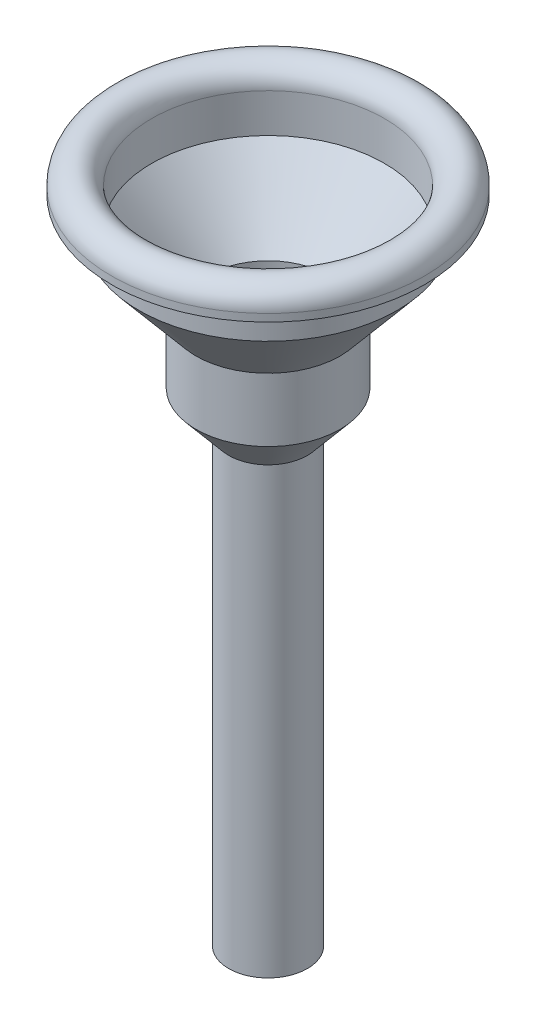
ISO-10303-21;
HEADER;
FILE_DESCRIPTION(('STEP AP214'),'2;1');
FILE_NAME('part.step','',(''),(''),'','','');
FILE_SCHEMA(('AUTOMOTIVE_DESIGN { 1 0 10303 214 1 1 1 1 }'));
ENDSEC;
DATA;
#1=APPLICATION_CONTEXT('core data for automotive mechanical design processes');
#2=APPLICATION_PROTOCOL_DEFINITION('international standard','automotive_design',2000,#1);
#3=PRODUCT_CONTEXT('',#1,'mechanical');
#4=PRODUCT('Part','Part','',(#3));
#5=PRODUCT_RELATED_PRODUCT_CATEGORY('part','',(#4));
#6=PRODUCT_DEFINITION_FORMATION('','',#4);
#7=PRODUCT_DEFINITION_CONTEXT('part definition',#1,'design');
#8=PRODUCT_DEFINITION('design','',#6,#7);
#9=PRODUCT_DEFINITION_SHAPE('','',#8);
#10=(LENGTH_UNIT() NAMED_UNIT(*) SI_UNIT(.MILLI.,.METRE.));
#11=(NAMED_UNIT(*) PLANE_ANGLE_UNIT() SI_UNIT($,.RADIAN.));
#12=(NAMED_UNIT(*) SI_UNIT($,.STERADIAN.) SOLID_ANGLE_UNIT());
#13=UNCERTAINTY_MEASURE_WITH_UNIT(LENGTH_MEASURE(1.E-05),#10,'distance_accuracy_value','');
#14=(GEOMETRIC_REPRESENTATION_CONTEXT(3) GLOBAL_UNCERTAINTY_ASSIGNED_CONTEXT((#13)) GLOBAL_UNIT_ASSIGNED_CONTEXT((#10,
#11,#12)) REPRESENTATION_CONTEXT('',''));
#15=CARTESIAN_POINT('',(0.,0.,0.));
#16=DIRECTION('',(0.,0.,1.));
#17=DIRECTION('',(1.,0.,0.));
#18=AXIS2_PLACEMENT_3D('',#15,#16,#17);
#19=CARTESIAN_POINT('',(0.,5.18497830182876,0.));
#20=DIRECTION('',(0.,-1.,0.));
#21=DIRECTION('',(1.,0.,0.));
#22=AXIS2_PLACEMENT_3D('',#19,#20,#21);
#23=TOROIDAL_SURFACE('',#22,1.07473695625731,0.157670585602117);
#24=CARTESIAN_POINT('',(0.,5.18497830182876,0.));
#25=DIRECTION('',(0.,-1.,0.));
#26=DIRECTION('',(1.,0.,0.));
#27=AXIS2_PLACEMENT_3D('',#24,#25,#26);
#28=CIRCLE('',#27,1.23240754185942);
#29=CARTESIAN_POINT('',(1.23240754185943,5.18497830182876,0.));
#30=VERTEX_POINT('',#29);
#31=EDGE_CURVE('E111',#30,#30,#28,.T.);
#32=ORIENTED_EDGE('',*,*,#31,.F.);
#33=EDGE_LOOP('',(#32));
#34=FACE_BOUND('',#33,.T.);
#35=CARTESIAN_POINT('',(0.,5.18497830182876,0.));
#36=DIRECTION('',(0.,-1.,0.));
#37=DIRECTION('',(1.,0.,0.));
#38=AXIS2_PLACEMENT_3D('',#35,#36,#37);
#39=CIRCLE('',#38,0.91706637065519);
#40=CARTESIAN_POINT('',(0.917066370655195,5.18497830182876,0.));
#41=VERTEX_POINT('',#40);
#42=EDGE_CURVE('E10',#41,#41,#39,.T.);
#43=ORIENTED_EDGE('',*,*,#42,.T.);
#44=EDGE_LOOP('',(#43));
#45=FACE_BOUND('',#44,.T.);
#46=ADVANCED_FACE('F42',(#34,#45),#23,.T.);
#47=CARTESIAN_POINT('',(0.,-31.3486062493764,0.));
#48=DIRECTION('',(0.,-1.,0.));
#49=DIRECTION('',(1.,0.,0.));
#50=AXIS2_PLACEMENT_3D('',#47,#48,#49);
#51=CYLINDRICAL_SURFACE('',#50,0.91706637065519);
#52=ORIENTED_EDGE('',*,*,#42,.F.);
#53=EDGE_LOOP('',(#52));
#54=FACE_BOUND('',#53,.T.);
#55=CARTESIAN_POINT('',(0.,4.87904591085749,0.));
#56=DIRECTION('',(0.,-1.,0.));
#57=DIRECTION('',(1.,0.,0.));
#58=AXIS2_PLACEMENT_3D('',#55,#56,#57);
#59=CIRCLE('',#58,0.917066370655189);
#60=CARTESIAN_POINT('',(0.917066370655194,4.87904591085749,0.));
#61=VERTEX_POINT('',#60);
#62=EDGE_CURVE('E49',#61,#61,#59,.T.);
#63=ORIENTED_EDGE('',*,*,#62,.T.);
#64=EDGE_LOOP('',(#63));
#65=FACE_BOUND('',#64,.T.);
#66=ADVANCED_FACE('F120',(#54,#65),#51,.F.);
#67=CARTESIAN_POINT('',(0.,4.34281480067421,0.));
#68=DIRECTION('',(0.,1.,0.));
#69=DIRECTION('',(-1.,0.,0.));
#70=AXIS2_PLACEMENT_3D('',#67,#68,#69);
#71=CONICAL_SURFACE('',#70,0.467115043874611,0.698131700797739);
#72=ORIENTED_EDGE('',*,*,#62,.F.);
#73=EDGE_LOOP('',(#72));
#74=FACE_BOUND('',#73,.T.);
#75=CARTESIAN_POINT('',(0.,4.34281480067421,0.));
#76=DIRECTION('',(0.,-1.,0.));
#77=DIRECTION('',(1.,0.,0.));
#78=AXIS2_PLACEMENT_3D('',#75,#76,#77);
#79=CIRCLE('',#78,0.467115043874611);
#80=CARTESIAN_POINT('',(0.467115043874617,4.34281480067421,0.));
#81=VERTEX_POINT('',#80);
#82=EDGE_CURVE('E56',#81,#81,#79,.T.);
#83=ORIENTED_EDGE('',*,*,#82,.T.);
#84=EDGE_LOOP('',(#83));
#85=FACE_BOUND('',#84,.T.);
#86=ADVANCED_FACE('F124',(#74,#85),#71,.F.);
#87=CARTESIAN_POINT('',(0.,-31.3486062493764,0.));
#88=DIRECTION('',(0.,-1.,0.));
#89=DIRECTION('',(1.,0.,0.));
#90=AXIS2_PLACEMENT_3D('',#87,#88,#89);
#91=CYLINDRICAL_SURFACE('',#90,0.467115043874611);
#92=ORIENTED_EDGE('',*,*,#82,.F.);
#93=EDGE_LOOP('',(#92));
#94=FACE_BOUND('',#93,.T.);
#95=CARTESIAN_POINT('',(0.,3.84281480067421,0.));
#96=DIRECTION('',(0.,-1.,0.));
#97=DIRECTION('',(1.,0.,0.));
#98=AXIS2_PLACEMENT_3D('',#95,#96,#97);
#99=CIRCLE('',#98,0.467115043874611);
#100=CARTESIAN_POINT('',(0.467115043874617,3.84281480067421,0.));
#101=VERTEX_POINT('',#100);
#102=EDGE_CURVE('E63',#101,#101,#99,.T.);
#103=ORIENTED_EDGE('',*,*,#102,.T.);
#104=EDGE_LOOP('',(#103));
#105=FACE_BOUND('',#104,.T.);
#106=ADVANCED_FACE('F129',(#94,#105),#91,.F.);
#107=CARTESIAN_POINT('',(0.,3.60790223898227,0.));
#108=DIRECTION('',(0.,1.,0.));
#109=DIRECTION('',(-1.,0.,0.));
#110=AXIS2_PLACEMENT_3D('',#107,#108,#109);
#111=CONICAL_SURFACE('',#110,0.269999999999994,0.698131700797732);
#112=ORIENTED_EDGE('',*,*,#102,.F.);
#113=EDGE_LOOP('',(#112));
#114=FACE_BOUND('',#113,.T.);
#115=CARTESIAN_POINT('',(0.,3.60790223898227,0.));
#116=DIRECTION('',(0.,-1.,0.));
#117=DIRECTION('',(1.,0.,0.));
#118=AXIS2_PLACEMENT_3D('',#115,#116,#117);
#119=CIRCLE('',#118,0.269999999999994);
#120=CARTESIAN_POINT('',(0.27,3.60790223898227,0.));
#121=VERTEX_POINT('',#120);
#122=EDGE_CURVE('E69',#121,#121,#119,.T.);
#123=ORIENTED_EDGE('',*,*,#122,.T.);
#124=EDGE_LOOP('',(#123));
#125=FACE_BOUND('',#124,.T.);
#126=ADVANCED_FACE('F135',(#114,#125),#111,.F.);
#127=CARTESIAN_POINT('',(0.,-31.3486062493764,0.));
#128=DIRECTION('',(0.,-1.,0.));
#129=DIRECTION('',(1.,0.,0.));
#130=AXIS2_PLACEMENT_3D('',#127,#128,#129);
#131=CYLINDRICAL_SURFACE('',#130,0.269999999999997);
#132=ORIENTED_EDGE('',*,*,#122,.F.);
#133=EDGE_LOOP('',(#132));
#134=FACE_BOUND('',#133,.T.);
#135=CARTESIAN_POINT('',(0.,0.,0.));
#136=DIRECTION('',(0.,-1.,0.));
#137=DIRECTION('',(1.,0.,0.));
#138=AXIS2_PLACEMENT_3D('',#135,#136,#137);
#139=CIRCLE('',#138,0.27);
#140=CARTESIAN_POINT('',(0.270000000000006,0.,0.));
#141=VERTEX_POINT('',#140);
#142=EDGE_CURVE('E73',#141,#141,#139,.T.);
#143=ORIENTED_EDGE('',*,*,#142,.T.);
#144=EDGE_LOOP('',(#143));
#145=FACE_BOUND('',#144,.T.);
#146=ADVANCED_FACE('F139',(#134,#145),#131,.F.);
#147=CARTESIAN_POINT('',(0.,0.,0.));
#148=DIRECTION('',(0.,-1.,0.));
#149=DIRECTION('',(1.,0.,0.));
#150=AXIS2_PLACEMENT_3D('',#147,#148,#149);
#151=PLANE('',#150);
#152=CARTESIAN_POINT('',(0.,0.,0.));
#153=DIRECTION('',(0.,-1.,0.));
#154=DIRECTION('',(1.,0.,0.));
#155=AXIS2_PLACEMENT_3D('',#152,#153,#154);
#156=CIRCLE('',#155,0.309999999999994);
#157=CARTESIAN_POINT('',(0.31,0.,0.));
#158=VERTEX_POINT('',#157);
#159=EDGE_CURVE('E76',#158,#158,#156,.T.);
#160=ORIENTED_EDGE('',*,*,#159,.T.);
#161=EDGE_LOOP('',(#160));
#162=FACE_BOUND('',#161,.T.);
#163=ORIENTED_EDGE('',*,*,#142,.F.);
#164=EDGE_LOOP('',(#163));
#165=FACE_BOUND('',#164,.T.);
#166=ADVANCED_FACE('F143',(#162,#165),#151,.T.);
#167=CARTESIAN_POINT('',(0.,-31.3486062493764,0.));
#168=DIRECTION('',(0.,-1.,0.));
#169=DIRECTION('',(1.,0.,0.));
#170=AXIS2_PLACEMENT_3D('',#167,#168,#169);
#171=CYLINDRICAL_SURFACE('',#170,0.309999999999994);
#172=CARTESIAN_POINT('',(0.,3.5,0.));
#173=DIRECTION('',(0.,-1.,0.));
#174=DIRECTION('',(1.,0.,0.));
#175=AXIS2_PLACEMENT_3D('',#172,#173,#174);
#176=CIRCLE('',#175,0.309999999999995);
#177=CARTESIAN_POINT('',(0.31,3.5,0.));
#178=VERTEX_POINT('',#177);
#179=EDGE_CURVE('E80',#178,#178,#176,.T.);
#180=ORIENTED_EDGE('',*,*,#179,.T.);
#181=EDGE_LOOP('',(#180));
#182=FACE_BOUND('',#181,.T.);
#183=ORIENTED_EDGE('',*,*,#159,.F.);
#184=EDGE_LOOP('',(#183));
#185=FACE_BOUND('',#184,.T.);
#186=ADVANCED_FACE('F147',(#182,#185),#171,.T.);
#187=CARTESIAN_POINT('',(0.,3.5,0.));
#188=DIRECTION('',(0.,1.,0.));
#189=DIRECTION('',(-1.,0.,0.));
#190=AXIS2_PLACEMENT_3D('',#187,#188,#189);
#191=CONICAL_SURFACE('',#190,0.309999999999995,0.698131700797738);
#192=CARTESIAN_POINT('',(0.,3.80641777724759,0.));
#193=DIRECTION('',(0.,-1.,0.));
#194=DIRECTION('',(1.,0.,0.));
#195=AXIS2_PLACEMENT_3D('',#192,#193,#194);
#196=CIRCLE('',#195,0.567115043874612);
#197=CARTESIAN_POINT('',(0.567115043874617,3.80641777724759,0.));
#198=VERTEX_POINT('',#197);
#199=EDGE_CURVE('E84',#198,#198,#196,.T.);
#200=ORIENTED_EDGE('',*,*,#199,.T.);
#201=EDGE_LOOP('',(#200));
#202=FACE_BOUND('',#201,.T.);
#203=ORIENTED_EDGE('',*,*,#179,.F.);
#204=EDGE_LOOP('',(#203));
#205=FACE_BOUND('',#204,.T.);
#206=ADVANCED_FACE('F151',(#202,#205),#191,.T.);
#207=CARTESIAN_POINT('',(0.,-31.3486062493764,0.));
#208=DIRECTION('',(0.,-1.,0.));
#209=DIRECTION('',(1.,0.,0.));
#210=AXIS2_PLACEMENT_3D('',#207,#208,#209);
#211=CYLINDRICAL_SURFACE('',#210,0.567115043874612);
#212=CARTESIAN_POINT('',(0.,4.30641777724759,0.));
#213=DIRECTION('',(0.,-1.,0.));
#214=DIRECTION('',(1.,0.,0.));
#215=AXIS2_PLACEMENT_3D('',#212,#213,#214);
#216=CIRCLE('',#215,0.567115043874611);
#217=CARTESIAN_POINT('',(0.567115043874617,4.30641777724759,0.));
#218=VERTEX_POINT('',#217);
#219=EDGE_CURVE('E88',#218,#218,#216,.T.);
#220=ORIENTED_EDGE('',*,*,#219,.T.);
#221=EDGE_LOOP('',(#220));
#222=FACE_BOUND('',#221,.T.);
#223=ORIENTED_EDGE('',*,*,#199,.F.);
#224=EDGE_LOOP('',(#223));
#225=FACE_BOUND('',#224,.T.);
#226=ADVANCED_FACE('F155',(#222,#225),#211,.T.);
#227=CARTESIAN_POINT('',(0.,4.30641777724759,0.));
#228=DIRECTION('',(0.,1.,0.));
#229=DIRECTION('',(-1.,0.,0.));
#230=AXIS2_PLACEMENT_3D('',#227,#228,#229);
#231=CONICAL_SURFACE('',#230,0.567115043874611,0.698131700797733);
#232=CARTESIAN_POINT('',(0.,4.84264888743088,0.));
#233=DIRECTION('',(0.,-1.,0.));
#234=DIRECTION('',(1.,0.,0.));
#235=AXIS2_PLACEMENT_3D('',#232,#233,#234);
#236=CIRCLE('',#235,1.01706637065519);
#237=CARTESIAN_POINT('',(1.01706637065519,4.84264888743088,0.));
#238=VERTEX_POINT('',#237);
#239=EDGE_CURVE('E92',#238,#238,#236,.T.);
#240=ORIENTED_EDGE('',*,*,#239,.T.);
#241=EDGE_LOOP('',(#240));
#242=FACE_BOUND('',#241,.T.);
#243=ORIENTED_EDGE('',*,*,#219,.F.);
#244=EDGE_LOOP('',(#243));
#245=FACE_BOUND('',#244,.T.);
#246=ADVANCED_FACE('F159',(#242,#245),#231,.T.);
#247=CARTESIAN_POINT('',(0.,-31.3486062493764,0.));
#248=DIRECTION('',(0.,-1.,0.));
#249=DIRECTION('',(1.,0.,0.));
#250=AXIS2_PLACEMENT_3D('',#247,#248,#249);
#251=CYLINDRICAL_SURFACE('',#250,1.01706637065519);
#252=CARTESIAN_POINT('',(0.,5.18497830182876,0.));
#253=DIRECTION('',(0.,-1.,0.));
#254=DIRECTION('',(1.,0.,0.));
#255=AXIS2_PLACEMENT_3D('',#252,#253,#254);
#256=CIRCLE('',#255,1.01706637065519);
#257=CARTESIAN_POINT('',(1.0170663706552,5.18497830182876,0.));
#258=VERTEX_POINT('',#257);
#259=EDGE_CURVE('E96',#258,#258,#256,.T.);
#260=ORIENTED_EDGE('',*,*,#259,.T.);
#261=EDGE_LOOP('',(#260));
#262=FACE_BOUND('',#261,.T.);
#263=ORIENTED_EDGE('',*,*,#239,.F.);
#264=EDGE_LOOP('',(#263));
#265=FACE_BOUND('',#264,.T.);
#266=ADVANCED_FACE('F163',(#262,#265),#251,.T.);
#267=CARTESIAN_POINT('',(0.,5.18497830182876,0.));
#268=DIRECTION('',(0.,-1.,0.));
#269=DIRECTION('',(1.,0.,0.));
#270=AXIS2_PLACEMENT_3D('',#267,#268,#269);
#271=TOROIDAL_SURFACE('',#270,1.07473695625731,0.0576705856021172);
#272=CARTESIAN_POINT('',(0.,5.18497830182876,0.));
#273=DIRECTION('',(0.,-1.,0.));
#274=DIRECTION('',(1.,0.,0.));
#275=AXIS2_PLACEMENT_3D('',#272,#273,#274);
#276=CIRCLE('',#275,1.13240754185942);
#277=CARTESIAN_POINT('',(1.13240754185943,5.18497830182876,0.));
#278=VERTEX_POINT('',#277);
#279=EDGE_CURVE('E100',#278,#278,#276,.T.);
#280=ORIENTED_EDGE('',*,*,#279,.T.);
#281=EDGE_LOOP('',(#280));
#282=FACE_BOUND('',#281,.T.);
#283=ORIENTED_EDGE('',*,*,#259,.F.);
#284=EDGE_LOOP('',(#283));
#285=FACE_BOUND('',#284,.T.);
#286=ADVANCED_FACE('F167',(#282,#285),#271,.F.);
#287=CARTESIAN_POINT('',(0.,-31.3486062493764,0.));
#288=DIRECTION('',(0.,-1.,0.));
#289=DIRECTION('',(1.,0.,0.));
#290=AXIS2_PLACEMENT_3D('',#287,#288,#289);
#291=CYLINDRICAL_SURFACE('',#290,1.13240754185942);
#292=CARTESIAN_POINT('',(0.,5.12601740618761,0.));
#293=DIRECTION('',(0.,-1.,0.));
#294=DIRECTION('',(1.,0.,0.));
#295=AXIS2_PLACEMENT_3D('',#292,#293,#294);
#296=CIRCLE('',#295,1.13240754185942);
#297=CARTESIAN_POINT('',(1.13240754185943,5.12601740618761,0.));
#298=VERTEX_POINT('',#297);
#299=EDGE_CURVE('E104',#298,#298,#296,.T.);
#300=ORIENTED_EDGE('',*,*,#299,.T.);
#301=EDGE_LOOP('',(#300));
#302=FACE_BOUND('',#301,.T.);
#303=ORIENTED_EDGE('',*,*,#279,.F.);
#304=EDGE_LOOP('',(#303));
#305=FACE_BOUND('',#304,.T.);
#306=ADVANCED_FACE('F171',(#302,#305),#291,.F.);
#307=CARTESIAN_POINT('',(0.,5.12601740618761,0.));
#308=DIRECTION('',(0.,-1.,0.));
#309=DIRECTION('',(1.,0.,0.));
#310=AXIS2_PLACEMENT_3D('',#307,#308,#309);
#311=PLANE('',#310);
#312=CARTESIAN_POINT('',(0.,5.12601740618761,0.));
#313=DIRECTION('',(0.,-1.,0.));
#314=DIRECTION('',(1.,0.,0.));
#315=AXIS2_PLACEMENT_3D('',#312,#313,#314);
#316=CIRCLE('',#315,1.23240754185942);
#317=CARTESIAN_POINT('',(1.23240754185943,5.12601740618761,0.));
#318=VERTEX_POINT('',#317);
#319=EDGE_CURVE('E107',#318,#318,#316,.T.);
#320=ORIENTED_EDGE('',*,*,#319,.T.);
#321=EDGE_LOOP('',(#320));
#322=FACE_BOUND('',#321,.T.);
#323=ORIENTED_EDGE('',*,*,#299,.F.);
#324=EDGE_LOOP('',(#323));
#325=FACE_BOUND('',#324,.T.);
#326=ADVANCED_FACE('F175',(#322,#325),#311,.T.);
#327=CARTESIAN_POINT('',(0.,-31.3486062493764,0.));
#328=DIRECTION('',(0.,-1.,0.));
#329=DIRECTION('',(1.,0.,0.));
#330=AXIS2_PLACEMENT_3D('',#327,#328,#329);
#331=CYLINDRICAL_SURFACE('',#330,1.23240754185942);
#332=ORIENTED_EDGE('',*,*,#319,.F.);
#333=EDGE_LOOP('',(#332));
#334=FACE_BOUND('',#333,.T.);
#335=ORIENTED_EDGE('',*,*,#31,.T.);
#336=EDGE_LOOP('',(#335));
#337=FACE_BOUND('',#336,.T.);
#338=ADVANCED_FACE('F117',(#334,#337),#331,.T.);
#339=CLOSED_SHELL('',(#46,#66,#86,#106,#126,#146,#166,#186,#206,#226,#246,#266,#286,#306,#326,#338));
#340=MANIFOLD_SOLID_BREP('B2',#339);
#341=ADVANCED_BREP_SHAPE_REPRESENTATION('',(#18,#340),#14);
#342=SHAPE_DEFINITION_REPRESENTATION(#9,#341);
ENDSEC;
END-ISO-10303-21;
